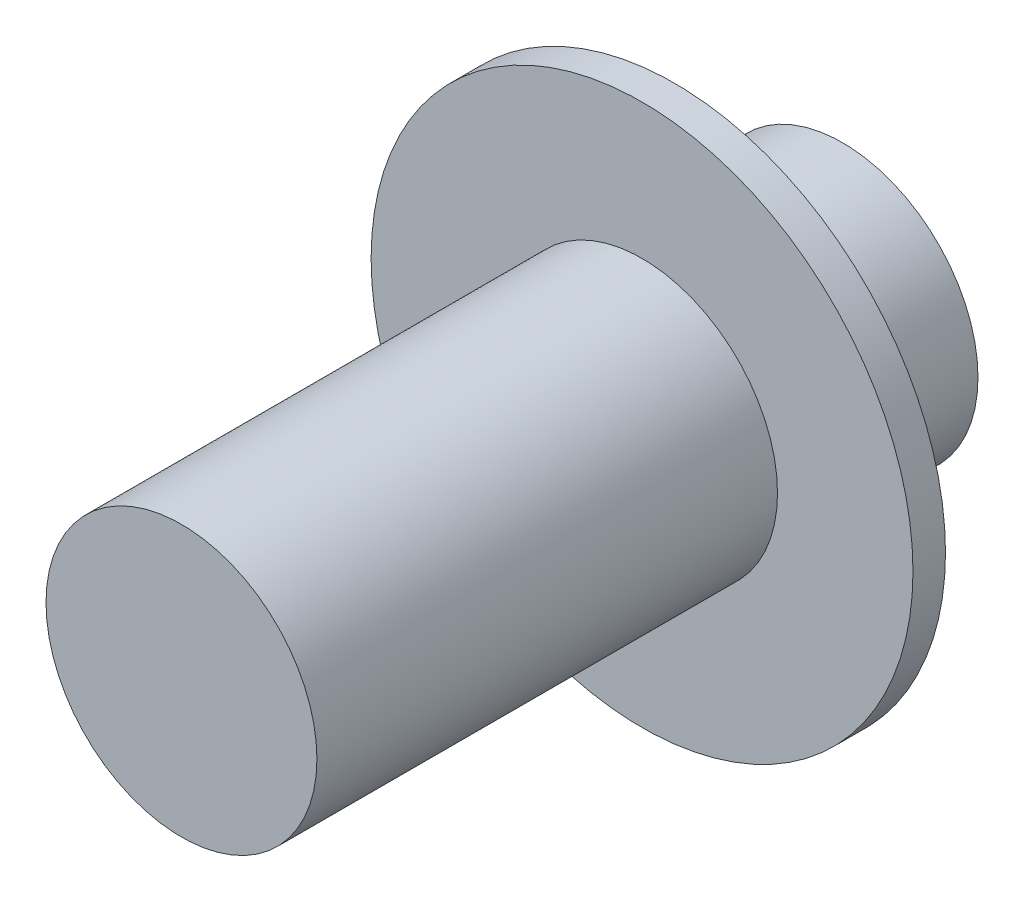
ISO-10303-21;
HEADER;
FILE_DESCRIPTION(('STEP AP214'),'2;1');
FILE_NAME('part.step','',(''),(''),'','','');
FILE_SCHEMA(('AUTOMOTIVE_DESIGN { 1 0 10303 214 1 1 1 1 }'));
ENDSEC;
DATA;
#1=APPLICATION_CONTEXT('core data for automotive mechanical design processes');
#2=APPLICATION_PROTOCOL_DEFINITION('international standard','automotive_design',2000,#1);
#3=PRODUCT_CONTEXT('',#1,'mechanical');
#4=PRODUCT('Part','Part','',(#3));
#5=PRODUCT_RELATED_PRODUCT_CATEGORY('part','',(#4));
#6=PRODUCT_DEFINITION_FORMATION('','',#4);
#7=PRODUCT_DEFINITION_CONTEXT('part definition',#1,'design');
#8=PRODUCT_DEFINITION('design','',#6,#7);
#9=PRODUCT_DEFINITION_SHAPE('','',#8);
#10=(LENGTH_UNIT() NAMED_UNIT(*) SI_UNIT(.MILLI.,.METRE.));
#11=(NAMED_UNIT(*) PLANE_ANGLE_UNIT() SI_UNIT($,.RADIAN.));
#12=(NAMED_UNIT(*) SI_UNIT($,.STERADIAN.) SOLID_ANGLE_UNIT());
#13=UNCERTAINTY_MEASURE_WITH_UNIT(LENGTH_MEASURE(1.E-05),#10,'distance_accuracy_value','');
#14=(GEOMETRIC_REPRESENTATION_CONTEXT(3) GLOBAL_UNCERTAINTY_ASSIGNED_CONTEXT((#13)) GLOBAL_UNIT_ASSIGNED_CONTEXT((#10,
#11,#12)) REPRESENTATION_CONTEXT('',''));
#15=CARTESIAN_POINT('',(0.,0.,0.));
#16=DIRECTION('',(0.,0.,1.));
#17=DIRECTION('',(1.,0.,0.));
#18=AXIS2_PLACEMENT_3D('',#15,#16,#17);
#19=CARTESIAN_POINT('',(0.,0.,-9.398));
#20=DIRECTION('',(0.,0.,1.));
#21=DIRECTION('',(1.,0.,0.));
#22=AXIS2_PLACEMENT_3D('',#19,#20,#21);
#23=PLANE('',#22);
#24=CARTESIAN_POINT('',(0.,0.,-9.398));
#25=DIRECTION('',(0.,0.,1.));
#26=DIRECTION('',(1.,0.,0.));
#27=AXIS2_PLACEMENT_3D('',#24,#25,#26);
#28=CIRCLE('',#27,6.35);
#29=CARTESIAN_POINT('',(6.35,0.,-9.398));
#30=VERTEX_POINT('',#29);
#31=EDGE_CURVE('E18',#30,#30,#28,.T.);
#32=ORIENTED_EDGE('',*,*,#31,.F.);
#33=EDGE_LOOP('',(#32));
#34=FACE_BOUND('',#33,.T.);
#35=ADVANCED_FACE('F15',(#34),#23,.F.);
#36=CARTESIAN_POINT('',(0.,0.,-10.9474));
#37=DIRECTION('',(0.,0.,1.));
#38=DIRECTION('',(1.,0.,0.));
#39=AXIS2_PLACEMENT_3D('',#36,#37,#38);
#40=CYLINDRICAL_SURFACE('',#39,6.35);
#41=CARTESIAN_POINT('',(0.,0.,-3.048));
#42=DIRECTION('',(0.,0.,1.));
#43=DIRECTION('',(1.,0.,0.));
#44=AXIS2_PLACEMENT_3D('',#41,#42,#43);
#45=CIRCLE('',#44,6.35);
#46=CARTESIAN_POINT('',(6.35,0.,-3.048));
#47=VERTEX_POINT('',#46);
#48=EDGE_CURVE('E40',#47,#47,#45,.F.);
#49=ORIENTED_EDGE('',*,*,#48,.T.);
#50=EDGE_LOOP('',(#49));
#51=FACE_BOUND('',#50,.T.);
#52=ORIENTED_EDGE('',*,*,#31,.T.);
#53=EDGE_LOOP('',(#52));
#54=FACE_BOUND('',#53,.T.);
#55=ADVANCED_FACE('F47',(#51,#54),#40,.T.);
#56=CARTESIAN_POINT('',(0.,0.,-3.048));
#57=DIRECTION('',(0.,0.,1.));
#58=DIRECTION('',(1.,0.,0.));
#59=AXIS2_PLACEMENT_3D('',#56,#57,#58);
#60=PLANE('',#59);
#61=ORIENTED_EDGE('',*,*,#48,.F.);
#62=EDGE_LOOP('',(#61));
#63=FACE_BOUND('',#62,.T.);
#64=CARTESIAN_POINT('',(0.,0.,-3.048));
#65=DIRECTION('',(0.,0.,1.));
#66=DIRECTION('',(1.,0.,0.));
#67=AXIS2_PLACEMENT_3D('',#64,#65,#66);
#68=CIRCLE('',#67,8.001);
#69=CARTESIAN_POINT('',(8.001,0.,-3.048));
#70=VERTEX_POINT('',#69);
#71=EDGE_CURVE('E38',#70,#70,#68,.T.);
#72=ORIENTED_EDGE('',*,*,#71,.F.);
#73=EDGE_LOOP('',(#72));
#74=FACE_BOUND('',#73,.T.);
#75=ADVANCED_FACE('F54',(#63,#74),#60,.F.);
#76=CARTESIAN_POINT('',(0.,0.,-10.9474));
#77=DIRECTION('',(0.,0.,1.));
#78=DIRECTION('',(1.,0.,0.));
#79=AXIS2_PLACEMENT_3D('',#76,#77,#78);
#80=CYLINDRICAL_SURFACE('',#79,8.001);
#81=CARTESIAN_POINT('',(0.,0.,-1.524));
#82=DIRECTION('',(0.,0.,1.));
#83=DIRECTION('',(1.,0.,0.));
#84=AXIS2_PLACEMENT_3D('',#81,#82,#83);
#85=CIRCLE('',#84,8.001);
#86=CARTESIAN_POINT('',(8.001,0.,-1.524));
#87=VERTEX_POINT('',#86);
#88=EDGE_CURVE('E35',#87,#87,#85,.F.);
#89=ORIENTED_EDGE('',*,*,#88,.T.);
#90=EDGE_LOOP('',(#89));
#91=FACE_BOUND('',#90,.T.);
#92=ORIENTED_EDGE('',*,*,#71,.T.);
#93=EDGE_LOOP('',(#92));
#94=FACE_BOUND('',#93,.T.);
#95=ADVANCED_FACE('F77',(#91,#94),#80,.T.);
#96=CARTESIAN_POINT('',(0.,0.,-1.524));
#97=DIRECTION('',(0.,0.,1.));
#98=DIRECTION('',(1.,0.,0.));
#99=AXIS2_PLACEMENT_3D('',#96,#97,#98);
#100=PLANE('',#99);
#101=ORIENTED_EDGE('',*,*,#88,.F.);
#102=EDGE_LOOP('',(#101));
#103=FACE_BOUND('',#102,.T.);
#104=CARTESIAN_POINT('',(0.,0.,-1.524));
#105=DIRECTION('',(0.,0.,1.));
#106=DIRECTION('',(1.,0.,0.));
#107=AXIS2_PLACEMENT_3D('',#104,#105,#106);
#108=CIRCLE('',#107,12.7);
#109=CARTESIAN_POINT('',(12.7,0.,-1.524));
#110=VERTEX_POINT('',#109);
#111=EDGE_CURVE('E32',#110,#110,#108,.T.);
#112=ORIENTED_EDGE('',*,*,#111,.F.);
#113=EDGE_LOOP('',(#112));
#114=FACE_BOUND('',#113,.T.);
#115=ADVANCED_FACE('F73',(#103,#114),#100,.F.);
#116=CARTESIAN_POINT('',(0.,0.,-10.9474));
#117=DIRECTION('',(0.,0.,1.));
#118=DIRECTION('',(1.,0.,0.));
#119=AXIS2_PLACEMENT_3D('',#116,#117,#118);
#120=CYLINDRICAL_SURFACE('',#119,12.7);
#121=ORIENTED_EDGE('',*,*,#111,.T.);
#122=EDGE_LOOP('',(#121));
#123=FACE_BOUND('',#122,.T.);
#124=CARTESIAN_POINT('',(0.,0.,0.));
#125=DIRECTION('',(0.,0.,1.));
#126=DIRECTION('',(1.,0.,0.));
#127=AXIS2_PLACEMENT_3D('',#124,#125,#126);
#128=CIRCLE('',#127,12.7);
#129=CARTESIAN_POINT('',(12.7,0.,0.));
#130=VERTEX_POINT('',#129);
#131=EDGE_CURVE('E27',#130,#130,#128,.T.);
#132=ORIENTED_EDGE('',*,*,#131,.F.);
#133=EDGE_LOOP('',(#132));
#134=FACE_BOUND('',#133,.T.);
#135=ADVANCED_FACE('F69',(#123,#134),#120,.T.);
#136=CARTESIAN_POINT('',(0.,0.,0.));
#137=DIRECTION('',(0.,0.,1.));
#138=DIRECTION('',(1.,0.,0.));
#139=AXIS2_PLACEMENT_3D('',#136,#137,#138);
#140=PLANE('',#139);
#141=CARTESIAN_POINT('',(0.,0.,0.));
#142=DIRECTION('',(0.,0.,1.));
#143=DIRECTION('',(1.,0.,0.));
#144=AXIS2_PLACEMENT_3D('',#141,#142,#143);
#145=CIRCLE('',#144,6.35000000000001);
#146=CARTESIAN_POINT('',(6.35,0.,0.));
#147=VERTEX_POINT('',#146);
#148=EDGE_CURVE('E22',#147,#147,#145,.T.);
#149=ORIENTED_EDGE('',*,*,#148,.F.);
#150=EDGE_LOOP('',(#149));
#151=FACE_BOUND('',#150,.T.);
#152=ORIENTED_EDGE('',*,*,#131,.T.);
#153=EDGE_LOOP('',(#152));
#154=FACE_BOUND('',#153,.T.);
#155=ADVANCED_FACE('F62',(#151,#154),#140,.T.);
#156=CARTESIAN_POINT('',(0.,0.,21.59));
#157=DIRECTION('',(0.,0.,1.));
#158=DIRECTION('',(1.,0.,0.));
#159=AXIS2_PLACEMENT_3D('',#156,#157,#158);
#160=PLANE('',#159);
#161=CARTESIAN_POINT('',(0.,0.,21.59));
#162=DIRECTION('',(0.,0.,1.));
#163=DIRECTION('',(1.,0.,0.));
#164=AXIS2_PLACEMENT_3D('',#161,#162,#163);
#165=CIRCLE('',#164,6.35000000000001);
#166=CARTESIAN_POINT('',(6.35,0.,21.59));
#167=VERTEX_POINT('',#166);
#168=EDGE_CURVE('E10',#167,#167,#165,.F.);
#169=ORIENTED_EDGE('',*,*,#168,.F.);
#170=EDGE_LOOP('',(#169));
#171=FACE_BOUND('',#170,.T.);
#172=ADVANCED_FACE('F57',(#171),#160,.T.);
#173=CARTESIAN_POINT('',(0.,0.,-10.9474));
#174=DIRECTION('',(0.,0.,1.));
#175=DIRECTION('',(1.,0.,0.));
#176=AXIS2_PLACEMENT_3D('',#173,#174,#175);
#177=CYLINDRICAL_SURFACE('',#176,6.35000000000001);
#178=ORIENTED_EDGE('',*,*,#168,.T.);
#179=EDGE_LOOP('',(#178));
#180=FACE_BOUND('',#179,.T.);
#181=ORIENTED_EDGE('',*,*,#148,.T.);
#182=EDGE_LOOP('',(#181));
#183=FACE_BOUND('',#182,.T.);
#184=ADVANCED_FACE('F55',(#180,#183),#177,.T.);
#185=CLOSED_SHELL('',(#35,#55,#75,#95,#115,#135,#155,#172,#184));
#186=MANIFOLD_SOLID_BREP('B1',#185);
#187=ADVANCED_BREP_SHAPE_REPRESENTATION('',(#18,#186),#14);
#188=SHAPE_DEFINITION_REPRESENTATION(#9,#187);
ENDSEC;
END-ISO-10303-21;
